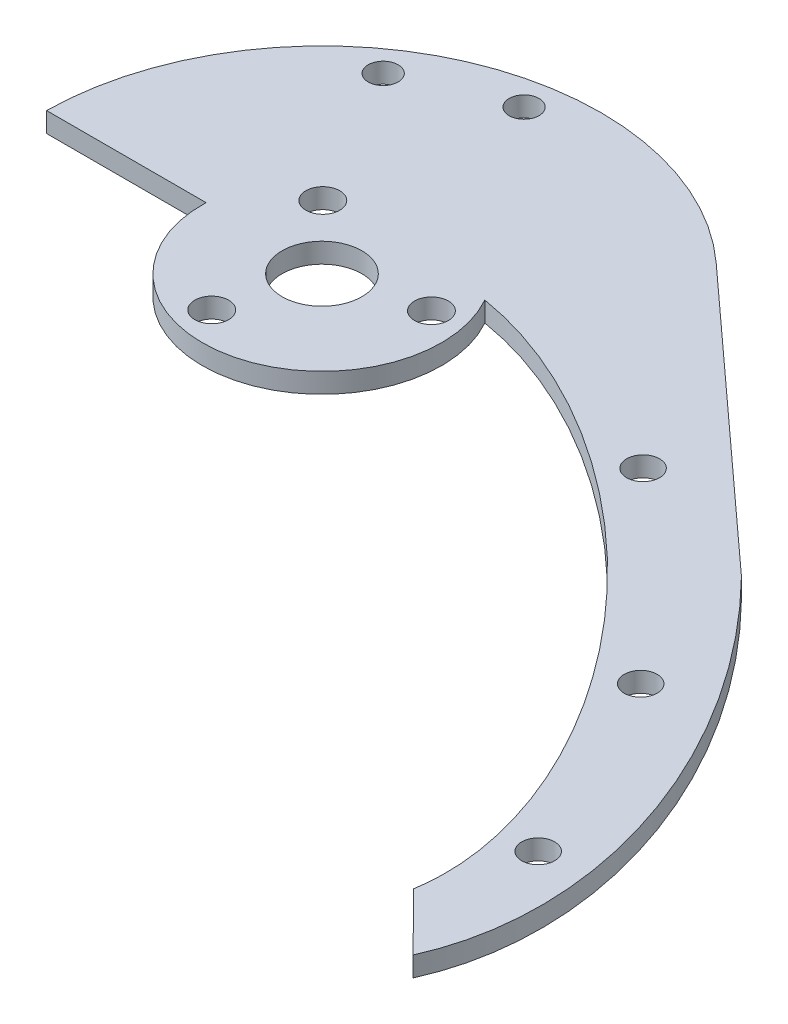
ISO-10303-21;
HEADER;
FILE_DESCRIPTION(('STEP AP214'),'2;1');
FILE_NAME('part.step','',(''),(''),'','','');
FILE_SCHEMA(('AUTOMOTIVE_DESIGN { 1 0 10303 214 1 1 1 1 }'));
ENDSEC;
DATA;
#1=APPLICATION_CONTEXT('core data for automotive mechanical design processes');
#2=APPLICATION_PROTOCOL_DEFINITION('international standard','automotive_design',2000,#1);
#3=PRODUCT_CONTEXT('',#1,'mechanical');
#4=PRODUCT('Part','Part','',(#3));
#5=PRODUCT_RELATED_PRODUCT_CATEGORY('part','',(#4));
#6=PRODUCT_DEFINITION_FORMATION('','',#4);
#7=PRODUCT_DEFINITION_CONTEXT('part definition',#1,'design');
#8=PRODUCT_DEFINITION('design','',#6,#7);
#9=PRODUCT_DEFINITION_SHAPE('','',#8);
#10=(LENGTH_UNIT() NAMED_UNIT(*) SI_UNIT(.MILLI.,.METRE.));
#11=(NAMED_UNIT(*) PLANE_ANGLE_UNIT() SI_UNIT($,.RADIAN.));
#12=(NAMED_UNIT(*) SI_UNIT($,.STERADIAN.) SOLID_ANGLE_UNIT());
#13=UNCERTAINTY_MEASURE_WITH_UNIT(LENGTH_MEASURE(1.E-05),#10,'distance_accuracy_value','');
#14=(GEOMETRIC_REPRESENTATION_CONTEXT(3) GLOBAL_UNCERTAINTY_ASSIGNED_CONTEXT((#13)) GLOBAL_UNIT_ASSIGNED_CONTEXT((#10,
#11,#12)) REPRESENTATION_CONTEXT('',''));
#15=CARTESIAN_POINT('',(0.,0.,0.));
#16=DIRECTION('',(0.,0.,1.));
#17=DIRECTION('',(1.,0.,0.));
#18=AXIS2_PLACEMENT_3D('',#15,#16,#17);
#19=CARTESIAN_POINT('',(25.9929288739405,2.,26.3318751431467));
#20=DIRECTION('',(0.,-1.,0.));
#21=DIRECTION('',(0.,0.,-1.));
#22=AXIS2_PLACEMENT_3D('',#19,#20,#21);
#23=PLANE('',#22);
#24=CARTESIAN_POINT('',(33.0134874720994,2.,0.793663480227819));
#25=DIRECTION('',(0.,1.,0.));
#26=DIRECTION('',(0.,0.,1.));
#27=AXIS2_PLACEMENT_3D('',#24,#25,#26);
#28=CIRCLE('',#27,1.65);
#29=CARTESIAN_POINT('',(33.0134874720994,2.,2.44366348022782));
#30=VERTEX_POINT('',#29);
#31=EDGE_CURVE('E210',#30,#30,#28,.T.);
#32=ORIENTED_EDGE('',*,*,#31,.F.);
#33=EDGE_LOOP('',(#32));
#34=FACE_BOUND('',#33,.T.);
#35=CARTESIAN_POINT('',(61.0345343545618,2.,39.3436446594242));
#36=DIRECTION('',(0.,1.,0.));
#37=DIRECTION('',(0.,0.,1.));
#38=AXIS2_PLACEMENT_3D('',#35,#36,#37);
#39=CIRCLE('',#38,1.65);
#40=CARTESIAN_POINT('',(61.0345343545618,2.,40.9936446594242));
#41=VERTEX_POINT('',#40);
#42=EDGE_CURVE('E204',#41,#41,#39,.T.);
#43=ORIENTED_EDGE('',*,*,#42,.F.);
#44=EDGE_LOOP('',(#43));
#45=FACE_BOUND('',#44,.T.);
#46=CARTESIAN_POINT('',(51.6199482403319,2.,19.6427514064504));
#47=DIRECTION('',(0.,1.,0.));
#48=DIRECTION('',(0.,0.,1.));
#49=AXIS2_PLACEMENT_3D('',#46,#47,#48);
#50=CIRCLE('',#49,1.65);
#51=CARTESIAN_POINT('',(51.6199482403319,2.,21.2927514064504));
#52=VERTEX_POINT('',#51);
#53=EDGE_CURVE('E207',#52,#52,#50,.T.);
#54=ORIENTED_EDGE('',*,*,#53,.F.);
#55=EDGE_LOOP('',(#54));
#56=FACE_BOUND('',#55,.T.);
#57=CARTESIAN_POINT('',(-14.3394109087762,2.,-20.4788011072248));
#58=DIRECTION('',(0.,1.,0.));
#59=DIRECTION('',(0.,0.,-1.));
#60=AXIS2_PLACEMENT_3D('',#57,#58,#59);
#61=CIRCLE('',#60,1.5);
#62=CARTESIAN_POINT('',(-14.3394109087762,2.,-21.9788011072248));
#63=VERTEX_POINT('',#62);
#64=EDGE_CURVE('E219',#63,#63,#61,.T.);
#65=ORIENTED_EDGE('',*,*,#64,.F.);
#66=EDGE_LOOP('',(#65));
#67=FACE_BOUND('',#66,.T.);
#68=CARTESIAN_POINT('',(-4.34120444167328,2.,-24.6201938253052));
#69=DIRECTION('',(0.,1.,0.));
#70=DIRECTION('',(0.,0.,1.));
#71=AXIS2_PLACEMENT_3D('',#68,#69,#70);
#72=CIRCLE('',#71,1.5);
#73=CARTESIAN_POINT('',(-4.34120444167328,2.,-23.1201938253052));
#74=VERTEX_POINT('',#73);
#75=EDGE_CURVE('E218',#74,#74,#72,.T.);
#76=ORIENTED_EDGE('',*,*,#75,.F.);
#77=EDGE_LOOP('',(#76));
#78=FACE_BOUND('',#77,.T.);
#79=CARTESIAN_POINT('',(25.9929288739405,2.,26.3318751431467));
#80=DIRECTION('',(0.,1.,0.));
#81=DIRECTION('',(-0.702511591187582,0.,-0.711672301166127));
#82=AXIS2_PLACEMENT_3D('',#79,#80,#81);
#83=ELLIPSE('',#82,48.,30.);
#84=CARTESIAN_POINT('',(63.7643964251187,2.,54.6316320154291));
#85=VERTEX_POINT('',#84);
#86=CARTESIAN_POINT('',(47.3430979089243,2.,5.25652740751931));
#87=VERTEX_POINT('',#86);
#88=EDGE_CURVE('E256',#85,#87,#83,.T.);
#89=ORIENTED_EDGE('',*,*,#88,.T.);
#90=DIRECTION('',(-0.739187546713708,0.,-0.673499644234034));
#91=VECTOR('',#90,1.);
#92=CARTESIAN_POINT('',(47.3430979089243,2.,5.25652740751931));
#93=LINE('',#92,#91);
#94=CARTESIAN_POINT('',(18.857990038553,2.,-20.6972513079838));
#95=VERTEX_POINT('',#94);
#96=EDGE_CURVE('E93',#87,#95,#93,.T.);
#97=ORIENTED_EDGE('',*,*,#96,.T.);
#98=CARTESIAN_POINT('',(0.,2.,0.));
#99=DIRECTION('',(0.,1.,0.));
#100=DIRECTION('',(0.,0.,-1.));
#101=AXIS2_PLACEMENT_3D('',#98,#99,#100);
#102=CIRCLE('',#101,28.);
#103=CARTESIAN_POINT('',(-27.9976502789953,2.,-0.362737997837238));
#104=VERTEX_POINT('',#103);
#105=EDGE_CURVE('E260',#95,#104,#102,.T.);
#106=ORIENTED_EDGE('',*,*,#105,.T.);
#107=DIRECTION('',(1.,0.,0.));
#108=VECTOR('',#107,1.);
#109=CARTESIAN_POINT('',(-11.9945162947459,2.,-0.362737997837457));
#110=LINE('',#109,#108);
#111=CARTESIAN_POINT('',(-11.9945162947459,2.,-0.36273799783746));
#112=VERTEX_POINT('',#111);
#113=EDGE_CURVE('E109',#104,#112,#110,.T.);
#114=ORIENTED_EDGE('',*,*,#113,.T.);
#115=CARTESIAN_POINT('',(0.,2.,0.));
#116=DIRECTION('',(0.,1.,0.));
#117=DIRECTION('',(0.,0.,1.));
#118=AXIS2_PLACEMENT_3D('',#115,#116,#117);
#119=CIRCLE('',#118,12.);
#120=CARTESIAN_POINT('',(10.4596924887143,2.,-5.88173724689679));
#121=VERTEX_POINT('',#120);
#122=EDGE_CURVE('E103',#112,#121,#119,.T.);
#123=ORIENTED_EDGE('',*,*,#122,.T.);
#124=CARTESIAN_POINT('',(25.9929288739405,2.,26.3318751431467));
#125=DIRECTION('',(0.,-1.,0.));
#126=DIRECTION('',(0.702511591187582,0.,0.711672301166128));
#127=AXIS2_PLACEMENT_3D('',#124,#125,#126);
#128=ELLIPSE('',#127,41.,20.5);
#129=CARTESIAN_POINT('',(58.0464093161412,2.,48.8390826896519));
#130=VERTEX_POINT('',#129);
#131=EDGE_CURVE('E107',#121,#130,#128,.T.);
#132=ORIENTED_EDGE('',*,*,#131,.T.);
#133=DIRECTION('',(0.702511591187577,0.,0.711672301166133));
#134=VECTOR('',#133,1.);
#135=CARTESIAN_POINT('',(58.0464093161412,2.,48.8390826896519));
#136=LINE('',#135,#134);
#137=EDGE_CURVE('E53',#130,#85,#136,.T.);
#138=ORIENTED_EDGE('',*,*,#137,.T.);
#139=EDGE_LOOP('',(#89,#97,#106,#114,#123,#132,#138));
#140=FACE_BOUND('',#139,.T.);
#141=CARTESIAN_POINT('',(0.,2.,0.));
#142=DIRECTION('',(0.,1.,0.));
#143=DIRECTION('',(0.,0.,1.));
#144=AXIS2_PLACEMENT_3D('',#141,#142,#143);
#145=CIRCLE('',#144,4.);
#146=CARTESIAN_POINT('',(0.,2.,4.));
#147=VERTEX_POINT('',#146);
#148=EDGE_CURVE('E251',#147,#147,#145,.T.);
#149=ORIENTED_EDGE('',*,*,#148,.F.);
#150=EDGE_LOOP('',(#149));
#151=FACE_BOUND('',#150,.T.);
#152=CARTESIAN_POINT('',(-6.32260432068822,2.,-6.40505071049517));
#153=DIRECTION('',(0.,1.,0.));
#154=DIRECTION('',(0.,0.,1.));
#155=AXIS2_PLACEMENT_3D('',#152,#153,#154);
#156=CIRCLE('',#155,1.7);
#157=CARTESIAN_POINT('',(-6.32260432068822,2.,-4.70505071049517));
#158=VERTEX_POINT('',#157);
#159=EDGE_CURVE('E245',#158,#158,#156,.T.);
#160=ORIENTED_EDGE('',*,*,#159,.F.);
#161=EDGE_LOOP('',(#160));
#162=FACE_BOUND('',#161,.T.);
#163=CARTESIAN_POINT('',(8.70823878816048,2.,-2.27301060454571));
#164=DIRECTION('',(0.,1.,0.));
#165=DIRECTION('',(0.,0.,1.));
#166=AXIS2_PLACEMENT_3D('',#163,#164,#165);
#167=CIRCLE('',#166,1.7);
#168=CARTESIAN_POINT('',(8.70823878816048,2.,-0.573010604545707));
#169=VERTEX_POINT('',#168);
#170=EDGE_CURVE('E239',#169,#169,#167,.T.);
#171=ORIENTED_EDGE('',*,*,#170,.F.);
#172=EDGE_LOOP('',(#171));
#173=FACE_BOUND('',#172,.T.);
#174=CARTESIAN_POINT('',(-2.38563446747228,2.,8.67806131504083));
#175=DIRECTION('',(0.,1.,0.));
#176=DIRECTION('',(0.,0.,1.));
#177=AXIS2_PLACEMENT_3D('',#174,#175,#176);
#178=CIRCLE('',#177,1.7);
#179=CARTESIAN_POINT('',(-2.38563446747228,2.,10.3780613150408));
#180=VERTEX_POINT('',#179);
#181=EDGE_CURVE('E233',#180,#180,#178,.T.);
#182=ORIENTED_EDGE('',*,*,#181,.F.);
#183=EDGE_LOOP('',(#182));
#184=FACE_BOUND('',#183,.T.);
#185=ADVANCED_FACE('F35',(#34,#45,#56,#67,#78,#140,#151,#162,#173,#184),#23,.F.);
#186=CARTESIAN_POINT('',(25.9929288739405,0.,26.3318751431467));
#187=DIRECTION('',(0.,-1.,0.));
#188=DIRECTION('',(0.,0.,-1.));
#189=AXIS2_PLACEMENT_3D('',#186,#187,#188);
#190=PLANE('',#189);
#191=CARTESIAN_POINT('',(33.0134874720994,0.,0.793663480227819));
#192=DIRECTION('',(0.,1.,0.));
#193=DIRECTION('',(0.,0.,1.));
#194=AXIS2_PLACEMENT_3D('',#191,#192,#193);
#195=CIRCLE('',#194,1.65);
#196=CARTESIAN_POINT('',(33.0134874720994,0.,2.44366348022782));
#197=VERTEX_POINT('',#196);
#198=EDGE_CURVE('E205',#197,#197,#195,.T.);
#199=ORIENTED_EDGE('',*,*,#198,.T.);
#200=EDGE_LOOP('',(#199));
#201=FACE_BOUND('',#200,.T.);
#202=CARTESIAN_POINT('',(61.0345343545618,0.,39.3436446594242));
#203=DIRECTION('',(0.,1.,0.));
#204=DIRECTION('',(0.,0.,1.));
#205=AXIS2_PLACEMENT_3D('',#202,#203,#204);
#206=CIRCLE('',#205,1.65);
#207=CARTESIAN_POINT('',(61.0345343545618,0.,40.9936446594242));
#208=VERTEX_POINT('',#207);
#209=EDGE_CURVE('E201',#208,#208,#206,.T.);
#210=ORIENTED_EDGE('',*,*,#209,.T.);
#211=EDGE_LOOP('',(#210));
#212=FACE_BOUND('',#211,.T.);
#213=CARTESIAN_POINT('',(51.6199482403319,0.,19.6427514064504));
#214=DIRECTION('',(0.,1.,0.));
#215=DIRECTION('',(0.,0.,1.));
#216=AXIS2_PLACEMENT_3D('',#213,#214,#215);
#217=CIRCLE('',#216,1.65);
#218=CARTESIAN_POINT('',(51.6199482403319,0.,21.2927514064504));
#219=VERTEX_POINT('',#218);
#220=EDGE_CURVE('E222',#219,#219,#217,.T.);
#221=ORIENTED_EDGE('',*,*,#220,.T.);
#222=EDGE_LOOP('',(#221));
#223=FACE_BOUND('',#222,.T.);
#224=CARTESIAN_POINT('',(-14.3394109087762,0.,-20.4788011072248));
#225=DIRECTION('',(0.,1.,0.));
#226=DIRECTION('',(0.,0.,-1.));
#227=AXIS2_PLACEMENT_3D('',#224,#225,#226);
#228=CIRCLE('',#227,1.5);
#229=CARTESIAN_POINT('',(-14.3394109087762,0.,-21.9788011072248));
#230=VERTEX_POINT('',#229);
#231=EDGE_CURVE('E215',#230,#230,#228,.T.);
#232=ORIENTED_EDGE('',*,*,#231,.T.);
#233=EDGE_LOOP('',(#232));
#234=FACE_BOUND('',#233,.T.);
#235=CARTESIAN_POINT('',(-4.34120444167328,0.,-24.6201938253052));
#236=DIRECTION('',(0.,1.,0.));
#237=DIRECTION('',(0.,0.,1.));
#238=AXIS2_PLACEMENT_3D('',#235,#236,#237);
#239=CIRCLE('',#238,1.5);
#240=CARTESIAN_POINT('',(-4.34120444167328,0.,-23.1201938253052));
#241=VERTEX_POINT('',#240);
#242=EDGE_CURVE('E227',#241,#241,#239,.T.);
#243=ORIENTED_EDGE('',*,*,#242,.T.);
#244=EDGE_LOOP('',(#243));
#245=FACE_BOUND('',#244,.T.);
#246=CARTESIAN_POINT('',(8.70823878816048,0.,-2.27301060454571));
#247=DIRECTION('',(0.,1.,0.));
#248=DIRECTION('',(0.,0.,1.));
#249=AXIS2_PLACEMENT_3D('',#246,#247,#248);
#250=CIRCLE('',#249,1.7);
#251=CARTESIAN_POINT('',(8.70823878816048,0.,-0.573010604545707));
#252=VERTEX_POINT('',#251);
#253=EDGE_CURVE('E236',#252,#252,#250,.T.);
#254=ORIENTED_EDGE('',*,*,#253,.T.);
#255=EDGE_LOOP('',(#254));
#256=FACE_BOUND('',#255,.T.);
#257=CARTESIAN_POINT('',(0.,0.,0.));
#258=DIRECTION('',(0.,1.,0.));
#259=DIRECTION('',(0.,0.,1.));
#260=AXIS2_PLACEMENT_3D('',#257,#258,#259);
#261=CIRCLE('',#260,4.);
#262=CARTESIAN_POINT('',(0.,0.,4.));
#263=VERTEX_POINT('',#262);
#264=EDGE_CURVE('E248',#263,#263,#261,.T.);
#265=ORIENTED_EDGE('',*,*,#264,.T.);
#266=EDGE_LOOP('',(#265));
#267=FACE_BOUND('',#266,.T.);
#268=CARTESIAN_POINT('',(25.9929288739405,0.,26.3318751431467));
#269=DIRECTION('',(0.,1.,0.));
#270=DIRECTION('',(-0.702511591187582,0.,-0.711672301166127));
#271=AXIS2_PLACEMENT_3D('',#268,#269,#270);
#272=ELLIPSE('',#271,48.,30.);
#273=CARTESIAN_POINT('',(63.7643964251187,0.,54.6316320154291));
#274=VERTEX_POINT('',#273);
#275=CARTESIAN_POINT('',(47.3430979089243,0.,5.25652740751931));
#276=VERTEX_POINT('',#275);
#277=EDGE_CURVE('E254',#274,#276,#272,.T.);
#278=ORIENTED_EDGE('',*,*,#277,.F.);
#279=DIRECTION('',(0.702511591187577,0.,0.711672301166133));
#280=VECTOR('',#279,1.);
#281=CARTESIAN_POINT('',(58.0464093161412,0.,48.8390826896519));
#282=LINE('',#281,#280);
#283=CARTESIAN_POINT('',(58.0464093161412,0.,48.8390826896519));
#284=VERTEX_POINT('',#283);
#285=EDGE_CURVE('E85',#284,#274,#282,.T.);
#286=ORIENTED_EDGE('',*,*,#285,.F.);
#287=CARTESIAN_POINT('',(25.9929288739405,0.,26.3318751431467));
#288=DIRECTION('',(0.,-1.,0.));
#289=DIRECTION('',(0.702511591187582,0.,0.711672301166128));
#290=AXIS2_PLACEMENT_3D('',#287,#288,#289);
#291=ELLIPSE('',#290,41.,20.5);
#292=CARTESIAN_POINT('',(10.4596924887143,0.,-5.88173724689679));
#293=VERTEX_POINT('',#292);
#294=EDGE_CURVE('E79',#293,#284,#291,.T.);
#295=ORIENTED_EDGE('',*,*,#294,.F.);
#296=CARTESIAN_POINT('',(0.,0.,0.));
#297=DIRECTION('',(0.,1.,0.));
#298=DIRECTION('',(0.,0.,1.));
#299=AXIS2_PLACEMENT_3D('',#296,#297,#298);
#300=CIRCLE('',#299,12.);
#301=CARTESIAN_POINT('',(-11.9945162947459,0.,-0.36273799783746));
#302=VERTEX_POINT('',#301);
#303=EDGE_CURVE('E117',#302,#293,#300,.T.);
#304=ORIENTED_EDGE('',*,*,#303,.F.);
#305=DIRECTION('',(1.,0.,0.));
#306=VECTOR('',#305,1.);
#307=CARTESIAN_POINT('',(-11.9945162947459,0.,-0.362737997837457));
#308=LINE('',#307,#306);
#309=CARTESIAN_POINT('',(-27.9976502789953,0.,-0.362737997837238));
#310=VERTEX_POINT('',#309);
#311=EDGE_CURVE('E269',#310,#302,#308,.T.);
#312=ORIENTED_EDGE('',*,*,#311,.F.);
#313=CARTESIAN_POINT('',(0.,0.,0.));
#314=DIRECTION('',(0.,1.,0.));
#315=DIRECTION('',(0.,0.,1.));
#316=AXIS2_PLACEMENT_3D('',#313,#314,#315);
#317=CIRCLE('',#316,28.);
#318=CARTESIAN_POINT('',(18.857990038553,0.,-20.6972513079838));
#319=VERTEX_POINT('',#318);
#320=EDGE_CURVE('E266',#319,#310,#317,.T.);
#321=ORIENTED_EDGE('',*,*,#320,.F.);
#322=DIRECTION('',(-0.739187546713708,0.,-0.673499644234034));
#323=VECTOR('',#322,1.);
#324=CARTESIAN_POINT('',(47.3430979089243,0.,5.25652740751931));
#325=LINE('',#324,#323);
#326=EDGE_CURVE('E272',#276,#319,#325,.T.);
#327=ORIENTED_EDGE('',*,*,#326,.F.);
#328=EDGE_LOOP('',(#278,#286,#295,#304,#312,#321,#327));
#329=FACE_BOUND('',#328,.T.);
#330=CARTESIAN_POINT('',(-6.32260432068822,0.,-6.40505071049517));
#331=DIRECTION('',(0.,1.,0.));
#332=DIRECTION('',(0.,0.,1.));
#333=AXIS2_PLACEMENT_3D('',#330,#331,#332);
#334=CIRCLE('',#333,1.7);
#335=CARTESIAN_POINT('',(-6.32260432068822,0.,-4.70505071049517));
#336=VERTEX_POINT('',#335);
#337=EDGE_CURVE('E242',#336,#336,#334,.T.);
#338=ORIENTED_EDGE('',*,*,#337,.T.);
#339=EDGE_LOOP('',(#338));
#340=FACE_BOUND('',#339,.T.);
#341=CARTESIAN_POINT('',(-2.38563446747228,0.,8.67806131504083));
#342=DIRECTION('',(0.,1.,0.));
#343=DIRECTION('',(0.,0.,1.));
#344=AXIS2_PLACEMENT_3D('',#341,#342,#343);
#345=CIRCLE('',#344,1.7);
#346=CARTESIAN_POINT('',(-2.38563446747228,0.,10.3780613150408));
#347=VERTEX_POINT('',#346);
#348=EDGE_CURVE('E230',#347,#347,#345,.T.);
#349=ORIENTED_EDGE('',*,*,#348,.T.);
#350=EDGE_LOOP('',(#349));
#351=FACE_BOUND('',#350,.T.);
#352=ADVANCED_FACE('F148',(#201,#212,#223,#234,#245,#256,#267,#329,#340,#351),#190,.T.);
#353=DIRECTION('',(0.,-1.,0.));
#354=VECTOR('',#353,1.);
#355=SURFACE_OF_LINEAR_EXTRUSION('',#83,#354);
#356=ORIENTED_EDGE('',*,*,#277,.T.);
#357=DIRECTION('',(0.,-1.,0.));
#358=VECTOR('',#357,1.);
#359=CARTESIAN_POINT('',(47.3430979089243,2.,5.25652740751931));
#360=LINE('',#359,#358);
#361=EDGE_CURVE('E11',#87,#276,#360,.T.);
#362=ORIENTED_EDGE('',*,*,#361,.F.);
#363=ORIENTED_EDGE('',*,*,#88,.F.);
#364=DIRECTION('',(0.,-1.,0.));
#365=VECTOR('',#364,1.);
#366=CARTESIAN_POINT('',(63.7643964251187,2.,54.6316320154291));
#367=LINE('',#366,#365);
#368=EDGE_CURVE('E123',#85,#274,#367,.T.);
#369=ORIENTED_EDGE('',*,*,#368,.T.);
#370=EDGE_LOOP('',(#356,#362,#363,#369));
#371=FACE_BOUND('',#370,.T.);
#372=ADVANCED_FACE('F37',(#371),#355,.F.);
#373=CARTESIAN_POINT('',(47.3430979089243,2.,5.25652740751931));
#374=DIRECTION('',(-0.673499644234034,0.,0.739187546713708));
#375=DIRECTION('',(0.739187546713708,0.,0.673499644234034));
#376=AXIS2_PLACEMENT_3D('',#373,#374,#375);
#377=PLANE('',#376);
#378=ORIENTED_EDGE('',*,*,#326,.T.);
#379=DIRECTION('',(0.,-1.,0.));
#380=VECTOR('',#379,1.);
#381=CARTESIAN_POINT('',(18.857990038553,2.,-20.6972513079838));
#382=LINE('',#381,#380);
#383=EDGE_CURVE('E45',#95,#319,#382,.T.);
#384=ORIENTED_EDGE('',*,*,#383,.F.);
#385=ORIENTED_EDGE('',*,*,#96,.F.);
#386=ORIENTED_EDGE('',*,*,#361,.T.);
#387=EDGE_LOOP('',(#378,#384,#385,#386));
#388=FACE_BOUND('',#387,.T.);
#389=ADVANCED_FACE('F142',(#388),#377,.F.);
#390=CARTESIAN_POINT('',(0.,2.,0.));
#391=DIRECTION('',(0.,-1.,0.));
#392=DIRECTION('',(0.,0.,-1.));
#393=AXIS2_PLACEMENT_3D('',#390,#391,#392);
#394=CYLINDRICAL_SURFACE('',#393,28.);
#395=ORIENTED_EDGE('',*,*,#320,.T.);
#396=DIRECTION('',(0.,-1.,0.));
#397=VECTOR('',#396,1.);
#398=CARTESIAN_POINT('',(-27.9976502789953,2.,-0.362737997837238));
#399=LINE('',#398,#397);
#400=EDGE_CURVE('E265',#104,#310,#399,.T.);
#401=ORIENTED_EDGE('',*,*,#400,.F.);
#402=ORIENTED_EDGE('',*,*,#105,.F.);
#403=ORIENTED_EDGE('',*,*,#383,.T.);
#404=EDGE_LOOP('',(#395,#401,#402,#403));
#405=FACE_BOUND('',#404,.T.);
#406=ADVANCED_FACE('F139',(#405),#394,.T.);
#407=CARTESIAN_POINT('',(-11.9945162947459,2.,-0.362737997837457));
#408=DIRECTION('',(0.,0.,-1.));
#409=DIRECTION('',(-1.,0.,0.));
#410=AXIS2_PLACEMENT_3D('',#407,#408,#409);
#411=PLANE('',#410);
#412=ORIENTED_EDGE('',*,*,#311,.T.);
#413=DIRECTION('',(0.,-1.,0.));
#414=VECTOR('',#413,1.);
#415=CARTESIAN_POINT('',(-11.9945162947459,2.,-0.36273799783746));
#416=LINE('',#415,#414);
#417=EDGE_CURVE('E118',#112,#302,#416,.T.);
#418=ORIENTED_EDGE('',*,*,#417,.F.);
#419=ORIENTED_EDGE('',*,*,#113,.F.);
#420=ORIENTED_EDGE('',*,*,#400,.T.);
#421=EDGE_LOOP('',(#412,#418,#419,#420));
#422=FACE_BOUND('',#421,.T.);
#423=ADVANCED_FACE('F136',(#422),#411,.F.);
#424=CARTESIAN_POINT('',(0.,2.,0.));
#425=DIRECTION('',(0.,-1.,0.));
#426=DIRECTION('',(0.,0.,-1.));
#427=AXIS2_PLACEMENT_3D('',#424,#425,#426);
#428=CYLINDRICAL_SURFACE('',#427,12.);
#429=ORIENTED_EDGE('',*,*,#303,.T.);
#430=DIRECTION('',(0.,-1.,0.));
#431=VECTOR('',#430,1.);
#432=CARTESIAN_POINT('',(10.4596924887143,2.,-5.88173724689679));
#433=LINE('',#432,#431);
#434=EDGE_CURVE('E114',#121,#293,#433,.T.);
#435=ORIENTED_EDGE('',*,*,#434,.F.);
#436=ORIENTED_EDGE('',*,*,#122,.F.);
#437=ORIENTED_EDGE('',*,*,#417,.T.);
#438=EDGE_LOOP('',(#429,#435,#436,#437));
#439=FACE_BOUND('',#438,.T.);
#440=ADVANCED_FACE('F115',(#439),#428,.T.);
#441=DIRECTION('',(0.,-1.,0.));
#442=VECTOR('',#441,1.);
#443=SURFACE_OF_LINEAR_EXTRUSION('',#128,#442);
#444=ORIENTED_EDGE('',*,*,#294,.T.);
#445=DIRECTION('',(0.,-1.,0.));
#446=VECTOR('',#445,1.);
#447=CARTESIAN_POINT('',(58.0464093161412,2.,48.8390826896519));
#448=LINE('',#447,#446);
#449=EDGE_CURVE('E119',#130,#284,#448,.T.);
#450=ORIENTED_EDGE('',*,*,#449,.F.);
#451=ORIENTED_EDGE('',*,*,#131,.F.);
#452=ORIENTED_EDGE('',*,*,#434,.T.);
#453=EDGE_LOOP('',(#444,#450,#451,#452));
#454=FACE_BOUND('',#453,.T.);
#455=ADVANCED_FACE('F121',(#454),#443,.F.);
#456=CARTESIAN_POINT('',(58.0464093161412,2.,48.8390826896519));
#457=DIRECTION('',(0.711672301166133,0.,-0.702511591187577));
#458=DIRECTION('',(-0.702511591187577,0.,-0.711672301166133));
#459=AXIS2_PLACEMENT_3D('',#456,#457,#458);
#460=PLANE('',#459);
#461=ORIENTED_EDGE('',*,*,#285,.T.);
#462=ORIENTED_EDGE('',*,*,#368,.F.);
#463=ORIENTED_EDGE('',*,*,#137,.F.);
#464=ORIENTED_EDGE('',*,*,#449,.T.);
#465=EDGE_LOOP('',(#461,#462,#463,#464));
#466=FACE_BOUND('',#465,.T.);
#467=ADVANCED_FACE('F132',(#466),#460,.F.);
#468=CARTESIAN_POINT('',(0.,2.,0.));
#469=DIRECTION('',(0.,-1.,0.));
#470=DIRECTION('',(0.,0.,-1.));
#471=AXIS2_PLACEMENT_3D('',#468,#469,#470);
#472=CYLINDRICAL_SURFACE('',#471,4.);
#473=ORIENTED_EDGE('',*,*,#148,.T.);
#474=EDGE_LOOP('',(#473));
#475=FACE_BOUND('',#474,.T.);
#476=ORIENTED_EDGE('',*,*,#264,.F.);
#477=EDGE_LOOP('',(#476));
#478=FACE_BOUND('',#477,.T.);
#479=ADVANCED_FACE('F161',(#475,#478),#472,.F.);
#480=CARTESIAN_POINT('',(-6.32260432068822,2.,-6.40505071049517));
#481=DIRECTION('',(0.,-1.,0.));
#482=DIRECTION('',(0.,0.,-1.));
#483=AXIS2_PLACEMENT_3D('',#480,#481,#482);
#484=CYLINDRICAL_SURFACE('',#483,1.7);
#485=ORIENTED_EDGE('',*,*,#159,.T.);
#486=EDGE_LOOP('',(#485));
#487=FACE_BOUND('',#486,.T.);
#488=ORIENTED_EDGE('',*,*,#337,.F.);
#489=EDGE_LOOP('',(#488));
#490=FACE_BOUND('',#489,.T.);
#491=ADVANCED_FACE('F164',(#487,#490),#484,.F.);
#492=CARTESIAN_POINT('',(8.70823878816048,2.,-2.27301060454571));
#493=DIRECTION('',(0.,-1.,0.));
#494=DIRECTION('',(0.,0.,-1.));
#495=AXIS2_PLACEMENT_3D('',#492,#493,#494);
#496=CYLINDRICAL_SURFACE('',#495,1.7);
#497=ORIENTED_EDGE('',*,*,#170,.T.);
#498=EDGE_LOOP('',(#497));
#499=FACE_BOUND('',#498,.T.);
#500=ORIENTED_EDGE('',*,*,#253,.F.);
#501=EDGE_LOOP('',(#500));
#502=FACE_BOUND('',#501,.T.);
#503=ADVANCED_FACE('F168',(#499,#502),#496,.F.);
#504=CARTESIAN_POINT('',(-2.38563446747228,2.,8.67806131504083));
#505=DIRECTION('',(0.,-1.,0.));
#506=DIRECTION('',(0.,0.,-1.));
#507=AXIS2_PLACEMENT_3D('',#504,#505,#506);
#508=CYLINDRICAL_SURFACE('',#507,1.7);
#509=ORIENTED_EDGE('',*,*,#181,.T.);
#510=EDGE_LOOP('',(#509));
#511=FACE_BOUND('',#510,.T.);
#512=ORIENTED_EDGE('',*,*,#348,.F.);
#513=EDGE_LOOP('',(#512));
#514=FACE_BOUND('',#513,.T.);
#515=ADVANCED_FACE('F172',(#511,#514),#508,.F.);
#516=CARTESIAN_POINT('',(-4.34120444167328,0.,-24.6201938253052));
#517=DIRECTION('',(0.,1.,0.));
#518=DIRECTION('',(0.,0.,1.));
#519=AXIS2_PLACEMENT_3D('',#516,#517,#518);
#520=CYLINDRICAL_SURFACE('',#519,1.5);
#521=ORIENTED_EDGE('',*,*,#242,.F.);
#522=EDGE_LOOP('',(#521));
#523=FACE_BOUND('',#522,.T.);
#524=ORIENTED_EDGE('',*,*,#75,.T.);
#525=EDGE_LOOP('',(#524));
#526=FACE_BOUND('',#525,.T.);
#527=ADVANCED_FACE('F176',(#523,#526),#520,.F.);
#528=CARTESIAN_POINT('',(-14.3394109087762,0.,-20.4788011072248));
#529=DIRECTION('',(0.,1.,0.));
#530=DIRECTION('',(0.,0.,1.));
#531=AXIS2_PLACEMENT_3D('',#528,#529,#530);
#532=CYLINDRICAL_SURFACE('',#531,1.5);
#533=ORIENTED_EDGE('',*,*,#231,.F.);
#534=EDGE_LOOP('',(#533));
#535=FACE_BOUND('',#534,.T.);
#536=ORIENTED_EDGE('',*,*,#64,.T.);
#537=EDGE_LOOP('',(#536));
#538=FACE_BOUND('',#537,.T.);
#539=ADVANCED_FACE('F180',(#535,#538),#532,.F.);
#540=CARTESIAN_POINT('',(51.6199482403319,0.,19.6427514064504));
#541=DIRECTION('',(0.,1.,0.));
#542=DIRECTION('',(0.,0.,1.));
#543=AXIS2_PLACEMENT_3D('',#540,#541,#542);
#544=CYLINDRICAL_SURFACE('',#543,1.65);
#545=ORIENTED_EDGE('',*,*,#220,.F.);
#546=EDGE_LOOP('',(#545));
#547=FACE_BOUND('',#546,.T.);
#548=ORIENTED_EDGE('',*,*,#53,.T.);
#549=EDGE_LOOP('',(#548));
#550=FACE_BOUND('',#549,.T.);
#551=ADVANCED_FACE('F182',(#547,#550),#544,.F.);
#552=CARTESIAN_POINT('',(61.0345343545618,0.,39.3436446594242));
#553=DIRECTION('',(0.,1.,0.));
#554=DIRECTION('',(0.,0.,1.));
#555=AXIS2_PLACEMENT_3D('',#552,#553,#554);
#556=CYLINDRICAL_SURFACE('',#555,1.65);
#557=ORIENTED_EDGE('',*,*,#209,.F.);
#558=EDGE_LOOP('',(#557));
#559=FACE_BOUND('',#558,.T.);
#560=ORIENTED_EDGE('',*,*,#42,.T.);
#561=EDGE_LOOP('',(#560));
#562=FACE_BOUND('',#561,.T.);
#563=ADVANCED_FACE('F185',(#559,#562),#556,.F.);
#564=CARTESIAN_POINT('',(33.0134874720994,0.,0.793663480227819));
#565=DIRECTION('',(0.,1.,0.));
#566=DIRECTION('',(0.,0.,1.));
#567=AXIS2_PLACEMENT_3D('',#564,#565,#566);
#568=CYLINDRICAL_SURFACE('',#567,1.65);
#569=ORIENTED_EDGE('',*,*,#198,.F.);
#570=EDGE_LOOP('',(#569));
#571=FACE_BOUND('',#570,.T.);
#572=ORIENTED_EDGE('',*,*,#31,.T.);
#573=EDGE_LOOP('',(#572));
#574=FACE_BOUND('',#573,.T.);
#575=ADVANCED_FACE('F190',(#571,#574),#568,.F.);
#576=CLOSED_SHELL('',(#185,#352,#372,#389,#406,#423,#440,#455,#467,#479,#491,#503,#515,#527,
#539,#551,#563,#575));
#577=MANIFOLD_SOLID_BREP('B2',#576);
#578=ADVANCED_BREP_SHAPE_REPRESENTATION('',(#18,#577),#14);
#579=SHAPE_DEFINITION_REPRESENTATION(#9,#578);
ENDSEC;
END-ISO-10303-21;
